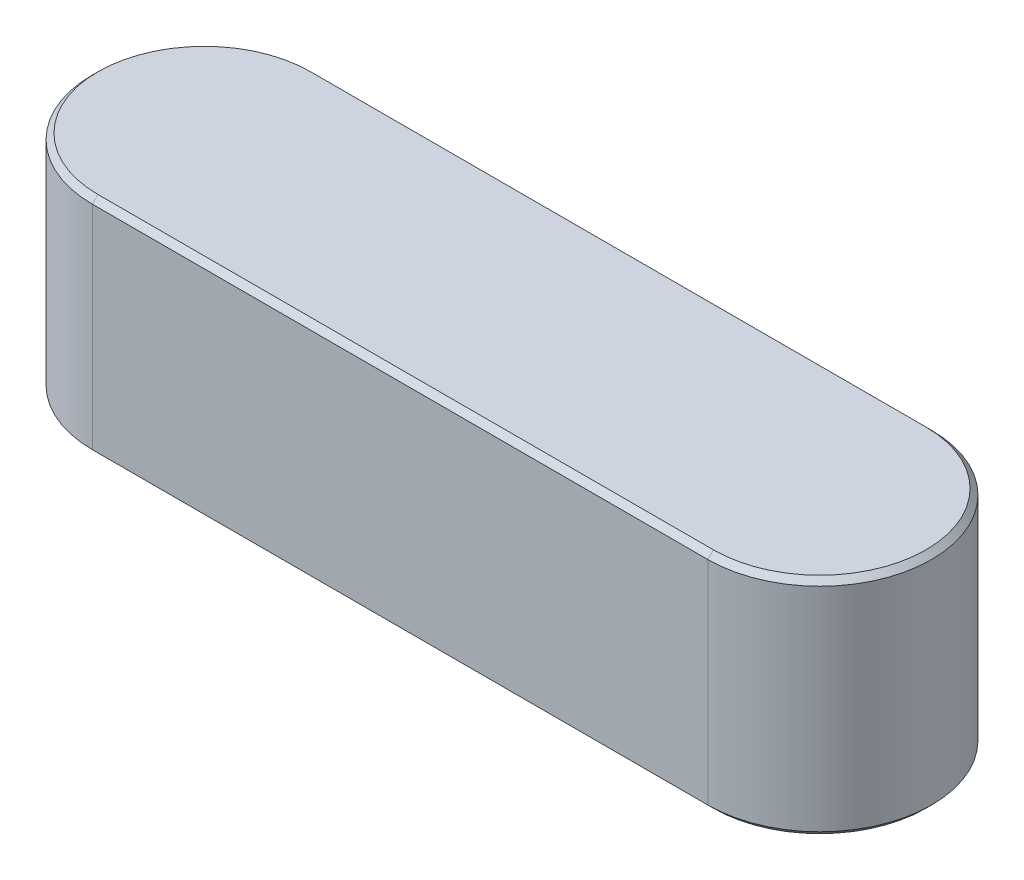
ISO-10303-21;
HEADER;
FILE_DESCRIPTION(('STEP AP214'),'2;1');
FILE_NAME('part.step','',(''),(''),'','','');
FILE_SCHEMA(('AUTOMOTIVE_DESIGN { 1 0 10303 214 1 1 1 1 }'));
ENDSEC;
DATA;
#1=APPLICATION_CONTEXT('core data for automotive mechanical design processes');
#2=APPLICATION_PROTOCOL_DEFINITION('international standard','automotive_design',2000,#1);
#3=PRODUCT_CONTEXT('',#1,'mechanical');
#4=PRODUCT('Part','Part','',(#3));
#5=PRODUCT_RELATED_PRODUCT_CATEGORY('part','',(#4));
#6=PRODUCT_DEFINITION_FORMATION('','',#4);
#7=PRODUCT_DEFINITION_CONTEXT('part definition',#1,'design');
#8=PRODUCT_DEFINITION('design','',#6,#7);
#9=PRODUCT_DEFINITION_SHAPE('','',#8);
#10=(LENGTH_UNIT() NAMED_UNIT(*) SI_UNIT(.MILLI.,.METRE.));
#11=(NAMED_UNIT(*) PLANE_ANGLE_UNIT() SI_UNIT($,.RADIAN.));
#12=(NAMED_UNIT(*) SI_UNIT($,.STERADIAN.) SOLID_ANGLE_UNIT());
#13=UNCERTAINTY_MEASURE_WITH_UNIT(LENGTH_MEASURE(1.E-05),#10,'distance_accuracy_value','');
#14=(GEOMETRIC_REPRESENTATION_CONTEXT(3) GLOBAL_UNCERTAINTY_ASSIGNED_CONTEXT((#13)) GLOBAL_UNIT_ASSIGNED_CONTEXT((#10,
#11,#12)) REPRESENTATION_CONTEXT('',''));
#15=CARTESIAN_POINT('',(0.,0.,0.));
#16=DIRECTION('',(0.,0.,1.));
#17=DIRECTION('',(1.,0.,0.));
#18=AXIS2_PLACEMENT_3D('',#15,#16,#17);
#19=CARTESIAN_POINT('',(-5.5,4.,0.));
#20=DIRECTION('',(0.,-1.,0.));
#21=DIRECTION('',(0.,0.,-1.));
#22=AXIS2_PLACEMENT_3D('',#19,#20,#21);
#23=CYLINDRICAL_SURFACE('',#22,2.);
#24=DIRECTION('',(0.,-1.,0.));
#25=VECTOR('',#24,1.);
#26=CARTESIAN_POINT('',(-5.5,4.,-2.));
#27=LINE('',#26,#25);
#28=CARTESIAN_POINT('',(-5.5,3.9,-2.));
#29=VERTEX_POINT('',#28);
#30=CARTESIAN_POINT('',(-5.5,0.100000000000003,-2.));
#31=VERTEX_POINT('',#30);
#32=EDGE_CURVE('E143',#29,#31,#27,.T.);
#33=ORIENTED_EDGE('',*,*,#32,.T.);
#34=CARTESIAN_POINT('',(-5.5,0.100000000000003,0.));
#35=DIRECTION('',(0.,1.,0.));
#36=DIRECTION('',(0.,0.,1.));
#37=AXIS2_PLACEMENT_3D('',#34,#35,#36);
#38=CIRCLE('',#37,2.);
#39=CARTESIAN_POINT('',(-5.5,0.100000000000003,2.));
#40=VERTEX_POINT('',#39);
#41=EDGE_CURVE('E152',#31,#40,#38,.T.);
#42=ORIENTED_EDGE('',*,*,#41,.T.);
#43=DIRECTION('',(0.,-1.,0.));
#44=VECTOR('',#43,1.);
#45=CARTESIAN_POINT('',(-5.5,4.,2.));
#46=LINE('',#45,#44);
#47=CARTESIAN_POINT('',(-5.5,3.9,2.));
#48=VERTEX_POINT('',#47);
#49=EDGE_CURVE('E121',#48,#40,#46,.T.);
#50=ORIENTED_EDGE('',*,*,#49,.F.);
#51=CARTESIAN_POINT('',(-5.5,3.9,0.));
#52=DIRECTION('',(0.,1.,0.));
#53=DIRECTION('',(0.,0.,1.));
#54=AXIS2_PLACEMENT_3D('',#51,#52,#53);
#55=CIRCLE('',#54,2.);
#56=EDGE_CURVE('E154',#48,#29,#55,.F.);
#57=ORIENTED_EDGE('',*,*,#56,.T.);
#58=EDGE_LOOP('',(#33,#42,#50,#57));
#59=FACE_BOUND('',#58,.T.);
#60=ADVANCED_FACE('F34',(#59),#23,.T.);
#61=CARTESIAN_POINT('',(-5.5,4.,2.));
#62=DIRECTION('',(0.,0.,-1.));
#63=DIRECTION('',(-1.,0.,0.));
#64=AXIS2_PLACEMENT_3D('',#61,#62,#63);
#65=PLANE('',#64);
#66=ORIENTED_EDGE('',*,*,#49,.T.);
#67=DIRECTION('',(1.,0.,0.));
#68=VECTOR('',#67,1.);
#69=CARTESIAN_POINT('',(-5.5,0.100000000000003,2.));
#70=LINE('',#69,#68);
#71=CARTESIAN_POINT('',(5.5,0.100000000000003,2.));
#72=VERTEX_POINT('',#71);
#73=EDGE_CURVE('E120',#40,#72,#70,.T.);
#74=ORIENTED_EDGE('',*,*,#73,.T.);
#75=DIRECTION('',(0.,-1.,0.));
#76=VECTOR('',#75,1.);
#77=CARTESIAN_POINT('',(5.5,4.,2.));
#78=LINE('',#77,#76);
#79=CARTESIAN_POINT('',(5.5,3.9,2.));
#80=VERTEX_POINT('',#79);
#81=EDGE_CURVE('E103',#80,#72,#78,.T.);
#82=ORIENTED_EDGE('',*,*,#81,.F.);
#83=DIRECTION('',(-1.,0.,0.));
#84=VECTOR('',#83,1.);
#85=CARTESIAN_POINT('',(-5.5,3.9,2.));
#86=LINE('',#85,#84);
#87=EDGE_CURVE('E117',#80,#48,#86,.T.);
#88=ORIENTED_EDGE('',*,*,#87,.T.);
#89=EDGE_LOOP('',(#66,#74,#82,#88));
#90=FACE_BOUND('',#89,.T.);
#91=ADVANCED_FACE('F116',(#90),#65,.F.);
#92=CARTESIAN_POINT('',(5.5,4.,0.));
#93=DIRECTION('',(0.,-1.,0.));
#94=DIRECTION('',(0.,0.,-1.));
#95=AXIS2_PLACEMENT_3D('',#92,#93,#94);
#96=CYLINDRICAL_SURFACE('',#95,2.);
#97=ORIENTED_EDGE('',*,*,#81,.T.);
#98=CARTESIAN_POINT('',(5.5,0.100000000000003,0.));
#99=DIRECTION('',(0.,1.,0.));
#100=DIRECTION('',(0.,0.,1.));
#101=AXIS2_PLACEMENT_3D('',#98,#99,#100);
#102=CIRCLE('',#101,2.);
#103=CARTESIAN_POINT('',(5.5,0.100000000000003,-2.));
#104=VERTEX_POINT('',#103);
#105=EDGE_CURVE('E109',#72,#104,#102,.T.);
#106=ORIENTED_EDGE('',*,*,#105,.T.);
#107=DIRECTION('',(0.,-1.,0.));
#108=VECTOR('',#107,1.);
#109=CARTESIAN_POINT('',(5.5,4.,-2.));
#110=LINE('',#109,#108);
#111=CARTESIAN_POINT('',(5.5,3.9,-2.));
#112=VERTEX_POINT('',#111);
#113=EDGE_CURVE('E105',#112,#104,#110,.T.);
#114=ORIENTED_EDGE('',*,*,#113,.F.);
#115=CARTESIAN_POINT('',(5.5,3.9,0.));
#116=DIRECTION('',(0.,1.,0.));
#117=DIRECTION('',(0.,0.,1.));
#118=AXIS2_PLACEMENT_3D('',#115,#116,#117);
#119=CIRCLE('',#118,2.);
#120=EDGE_CURVE('E100',#112,#80,#119,.F.);
#121=ORIENTED_EDGE('',*,*,#120,.T.);
#122=EDGE_LOOP('',(#97,#106,#114,#121));
#123=FACE_BOUND('',#122,.T.);
#124=ADVANCED_FACE('F102',(#123),#96,.T.);
#125=CARTESIAN_POINT('',(-5.5,4.,-2.));
#126=DIRECTION('',(0.,0.,1.));
#127=DIRECTION('',(1.,0.,0.));
#128=AXIS2_PLACEMENT_3D('',#125,#126,#127);
#129=PLANE('',#128);
#130=ORIENTED_EDGE('',*,*,#113,.T.);
#131=DIRECTION('',(-1.,0.,0.));
#132=VECTOR('',#131,1.);
#133=CARTESIAN_POINT('',(-5.5,0.100000000000003,-2.));
#134=LINE('',#133,#132);
#135=EDGE_CURVE('E156',#104,#31,#134,.T.);
#136=ORIENTED_EDGE('',*,*,#135,.T.);
#137=ORIENTED_EDGE('',*,*,#32,.F.);
#138=DIRECTION('',(1.,0.,0.));
#139=VECTOR('',#138,1.);
#140=CARTESIAN_POINT('',(5.5,3.9,-2.));
#141=LINE('',#140,#139);
#142=EDGE_CURVE('E158',#29,#112,#141,.T.);
#143=ORIENTED_EDGE('',*,*,#142,.T.);
#144=EDGE_LOOP('',(#130,#136,#137,#143));
#145=FACE_BOUND('',#144,.T.);
#146=ADVANCED_FACE('F196',(#145),#129,.F.);
#147=CARTESIAN_POINT('',(-5.5,4.,0.));
#148=DIRECTION('',(0.,1.,0.));
#149=DIRECTION('',(0.,0.,1.));
#150=AXIS2_PLACEMENT_3D('',#147,#148,#149);
#151=PLANE('',#150);
#152=CARTESIAN_POINT('',(5.5,4.,0.));
#153=DIRECTION('',(0.,1.,0.));
#154=DIRECTION('',(0.,0.,1.));
#155=AXIS2_PLACEMENT_3D('',#152,#153,#154);
#156=CIRCLE('',#155,1.9);
#157=CARTESIAN_POINT('',(5.5,4.,1.9));
#158=VERTEX_POINT('',#157);
#159=CARTESIAN_POINT('',(5.5,4.,-1.9));
#160=VERTEX_POINT('',#159);
#161=EDGE_CURVE('E43',#158,#160,#156,.T.);
#162=ORIENTED_EDGE('',*,*,#161,.T.);
#163=DIRECTION('',(-1.,0.,0.));
#164=VECTOR('',#163,1.);
#165=CARTESIAN_POINT('',(-5.5,4.,-1.9));
#166=LINE('',#165,#164);
#167=CARTESIAN_POINT('',(-5.5,4.,-1.9));
#168=VERTEX_POINT('',#167);
#169=EDGE_CURVE('E11',#160,#168,#166,.T.);
#170=ORIENTED_EDGE('',*,*,#169,.T.);
#171=CARTESIAN_POINT('',(-5.5,4.,0.));
#172=DIRECTION('',(0.,1.,0.));
#173=DIRECTION('',(0.,0.,1.));
#174=AXIS2_PLACEMENT_3D('',#171,#172,#173);
#175=CIRCLE('',#174,1.9);
#176=CARTESIAN_POINT('',(-5.5,4.,1.9));
#177=VERTEX_POINT('',#176);
#178=EDGE_CURVE('E150',#168,#177,#175,.T.);
#179=ORIENTED_EDGE('',*,*,#178,.T.);
#180=DIRECTION('',(1.,0.,0.));
#181=VECTOR('',#180,1.);
#182=CARTESIAN_POINT('',(5.5,4.,1.9));
#183=LINE('',#182,#181);
#184=EDGE_CURVE('E54',#177,#158,#183,.T.);
#185=ORIENTED_EDGE('',*,*,#184,.T.);
#186=EDGE_LOOP('',(#162,#170,#179,#185));
#187=FACE_BOUND('',#186,.T.);
#188=ADVANCED_FACE('F202',(#187),#151,.T.);
#189=CARTESIAN_POINT('',(-5.5,0.,0.));
#190=DIRECTION('',(0.,1.,0.));
#191=DIRECTION('',(0.,0.,1.));
#192=AXIS2_PLACEMENT_3D('',#189,#190,#191);
#193=PLANE('',#192);
#194=CARTESIAN_POINT('',(5.5,0.,0.));
#195=DIRECTION('',(0.,1.,0.));
#196=DIRECTION('',(0.,0.,1.));
#197=AXIS2_PLACEMENT_3D('',#194,#195,#196);
#198=CIRCLE('',#197,1.9);
#199=CARTESIAN_POINT('',(5.5,0.,-1.9));
#200=VERTEX_POINT('',#199);
#201=CARTESIAN_POINT('',(5.5,0.,1.9));
#202=VERTEX_POINT('',#201);
#203=EDGE_CURVE('E163',#200,#202,#198,.F.);
#204=ORIENTED_EDGE('',*,*,#203,.T.);
#205=DIRECTION('',(-1.,0.,0.));
#206=VECTOR('',#205,1.);
#207=CARTESIAN_POINT('',(-5.5,0.,1.9));
#208=LINE('',#207,#206);
#209=CARTESIAN_POINT('',(-5.5,0.,1.9));
#210=VERTEX_POINT('',#209);
#211=EDGE_CURVE('E110',#202,#210,#208,.T.);
#212=ORIENTED_EDGE('',*,*,#211,.T.);
#213=CARTESIAN_POINT('',(-5.5,0.,0.));
#214=DIRECTION('',(0.,1.,0.));
#215=DIRECTION('',(0.,0.,1.));
#216=AXIS2_PLACEMENT_3D('',#213,#214,#215);
#217=CIRCLE('',#216,1.9);
#218=CARTESIAN_POINT('',(-5.5,0.,-1.9));
#219=VERTEX_POINT('',#218);
#220=EDGE_CURVE('E167',#210,#219,#217,.F.);
#221=ORIENTED_EDGE('',*,*,#220,.T.);
#222=DIRECTION('',(1.,0.,0.));
#223=VECTOR('',#222,1.);
#224=CARTESIAN_POINT('',(-5.5,0.,-1.9));
#225=LINE('',#224,#223);
#226=EDGE_CURVE('E165',#219,#200,#225,.T.);
#227=ORIENTED_EDGE('',*,*,#226,.T.);
#228=EDGE_LOOP('',(#204,#212,#221,#227));
#229=FACE_BOUND('',#228,.T.);
#230=ADVANCED_FACE('F204',(#229),#193,.F.);
#231=CARTESIAN_POINT('',(-5.5,0.100000000000003,-2.));
#232=DIRECTION('',(0.,0.707106781186541,0.707106781186554));
#233=DIRECTION('',(-1.,0.,0.));
#234=AXIS2_PLACEMENT_3D('',#231,#232,#233);
#235=PLANE('',#234);
#236=DIRECTION('',(0.,0.707106781186554,-0.707106781186541));
#237=VECTOR('',#236,1.);
#238=CARTESIAN_POINT('',(5.5,0.,-1.9));
#239=LINE('',#238,#237);
#240=EDGE_CURVE('E144',#200,#104,#239,.T.);
#241=ORIENTED_EDGE('',*,*,#240,.F.);
#242=ORIENTED_EDGE('',*,*,#226,.F.);
#243=DIRECTION('',(0.,-0.707106781186554,0.707106781186541));
#244=VECTOR('',#243,1.);
#245=CARTESIAN_POINT('',(-5.5,0.100000000000003,-2.));
#246=LINE('',#245,#244);
#247=EDGE_CURVE('E140',#31,#219,#246,.T.);
#248=ORIENTED_EDGE('',*,*,#247,.F.);
#249=ORIENTED_EDGE('',*,*,#135,.F.);
#250=EDGE_LOOP('',(#241,#242,#248,#249));
#251=FACE_BOUND('',#250,.T.);
#252=ADVANCED_FACE('F183',(#251),#235,.F.);
#253=CARTESIAN_POINT('',(-5.5,0.100000000000003,0.));
#254=DIRECTION('',(0.,1.,0.));
#255=DIRECTION('',(0.,0.,1.));
#256=AXIS2_PLACEMENT_3D('',#253,#254,#255);
#257=CONICAL_SURFACE('',#256,2.,0.78539816339744);
#258=ORIENTED_EDGE('',*,*,#247,.T.);
#259=ORIENTED_EDGE('',*,*,#220,.F.);
#260=DIRECTION('',(0.,-0.707106781186554,-0.707106781186541));
#261=VECTOR('',#260,1.);
#262=CARTESIAN_POINT('',(-5.5,0.100000000000003,2.));
#263=LINE('',#262,#261);
#264=EDGE_CURVE('E131',#40,#210,#263,.T.);
#265=ORIENTED_EDGE('',*,*,#264,.F.);
#266=ORIENTED_EDGE('',*,*,#41,.F.);
#267=EDGE_LOOP('',(#258,#259,#265,#266));
#268=FACE_BOUND('',#267,.T.);
#269=ADVANCED_FACE('F187',(#268),#257,.T.);
#270=CARTESIAN_POINT('',(5.5,0.100000000000003,0.));
#271=DIRECTION('',(0.,1.,0.));
#272=DIRECTION('',(0.,0.,1.));
#273=AXIS2_PLACEMENT_3D('',#270,#271,#272);
#274=CONICAL_SURFACE('',#273,2.,0.78539816339744);
#275=ORIENTED_EDGE('',*,*,#240,.T.);
#276=ORIENTED_EDGE('',*,*,#105,.F.);
#277=DIRECTION('',(0.,0.707106781186554,0.707106781186541));
#278=VECTOR('',#277,1.);
#279=CARTESIAN_POINT('',(5.5,0.,1.9));
#280=LINE('',#279,#278);
#281=EDGE_CURVE('E130',#202,#72,#280,.T.);
#282=ORIENTED_EDGE('',*,*,#281,.F.);
#283=ORIENTED_EDGE('',*,*,#203,.F.);
#284=EDGE_LOOP('',(#275,#276,#282,#283));
#285=FACE_BOUND('',#284,.T.);
#286=ADVANCED_FACE('F195',(#285),#274,.T.);
#287=CARTESIAN_POINT('',(-5.5,0.100000000000003,2.));
#288=DIRECTION('',(0.,0.707106781186541,-0.707106781186554));
#289=DIRECTION('',(1.,0.,0.));
#290=AXIS2_PLACEMENT_3D('',#287,#288,#289);
#291=PLANE('',#290);
#292=ORIENTED_EDGE('',*,*,#264,.T.);
#293=ORIENTED_EDGE('',*,*,#211,.F.);
#294=ORIENTED_EDGE('',*,*,#281,.T.);
#295=ORIENTED_EDGE('',*,*,#73,.F.);
#296=EDGE_LOOP('',(#292,#293,#294,#295));
#297=FACE_BOUND('',#296,.T.);
#298=ADVANCED_FACE('F190',(#297),#291,.F.);
#299=CARTESIAN_POINT('',(-5.5,4.,1.9));
#300=DIRECTION('',(0.,0.707106781186554,0.707106781186541));
#301=DIRECTION('',(-1.,0.,0.));
#302=AXIS2_PLACEMENT_3D('',#299,#300,#301);
#303=PLANE('',#302);
#304=DIRECTION('',(0.,0.707106781186541,-0.707106781186554));
#305=VECTOR('',#304,1.);
#306=CARTESIAN_POINT('',(-5.5,3.9,2.));
#307=LINE('',#306,#305);
#308=EDGE_CURVE('E126',#48,#177,#307,.T.);
#309=ORIENTED_EDGE('',*,*,#308,.F.);
#310=ORIENTED_EDGE('',*,*,#87,.F.);
#311=DIRECTION('',(0.,-0.707106781186541,0.707106781186554));
#312=VECTOR('',#311,1.);
#313=CARTESIAN_POINT('',(5.5,4.,1.9));
#314=LINE('',#313,#312);
#315=EDGE_CURVE('E38',#158,#80,#314,.T.);
#316=ORIENTED_EDGE('',*,*,#315,.F.);
#317=ORIENTED_EDGE('',*,*,#184,.F.);
#318=EDGE_LOOP('',(#309,#310,#316,#317));
#319=FACE_BOUND('',#318,.T.);
#320=ADVANCED_FACE('F36',(#319),#303,.T.);
#321=CARTESIAN_POINT('',(5.5,4.,0.));
#322=DIRECTION('',(0.,-1.,0.));
#323=DIRECTION('',(0.,0.,-1.));
#324=AXIS2_PLACEMENT_3D('',#321,#322,#323);
#325=CONICAL_SURFACE('',#324,1.9,0.785398163397457);
#326=ORIENTED_EDGE('',*,*,#315,.T.);
#327=ORIENTED_EDGE('',*,*,#120,.F.);
#328=DIRECTION('',(0.,-0.707106781186541,-0.707106781186554));
#329=VECTOR('',#328,1.);
#330=CARTESIAN_POINT('',(5.5,4.,-1.9));
#331=LINE('',#330,#329);
#332=EDGE_CURVE('E133',#160,#112,#331,.T.);
#333=ORIENTED_EDGE('',*,*,#332,.F.);
#334=ORIENTED_EDGE('',*,*,#161,.F.);
#335=EDGE_LOOP('',(#326,#327,#333,#334));
#336=FACE_BOUND('',#335,.T.);
#337=ADVANCED_FACE('F129',(#336),#325,.T.);
#338=CARTESIAN_POINT('',(-5.5,4.,0.));
#339=DIRECTION('',(0.,-1.,0.));
#340=DIRECTION('',(0.,0.,-1.));
#341=AXIS2_PLACEMENT_3D('',#338,#339,#340);
#342=CONICAL_SURFACE('',#341,1.9,0.785398163397457);
#343=ORIENTED_EDGE('',*,*,#308,.T.);
#344=ORIENTED_EDGE('',*,*,#178,.F.);
#345=DIRECTION('',(0.,0.707106781186541,0.707106781186554));
#346=VECTOR('',#345,1.);
#347=CARTESIAN_POINT('',(-5.5,3.9,-2.));
#348=LINE('',#347,#346);
#349=EDGE_CURVE('E136',#29,#168,#348,.T.);
#350=ORIENTED_EDGE('',*,*,#349,.F.);
#351=ORIENTED_EDGE('',*,*,#56,.F.);
#352=EDGE_LOOP('',(#343,#344,#350,#351));
#353=FACE_BOUND('',#352,.T.);
#354=ADVANCED_FACE('F201',(#353),#342,.T.);
#355=CARTESIAN_POINT('',(-5.5,4.,-1.9));
#356=DIRECTION('',(0.,0.707106781186554,-0.707106781186541));
#357=DIRECTION('',(1.,0.,0.));
#358=AXIS2_PLACEMENT_3D('',#355,#356,#357);
#359=PLANE('',#358);
#360=ORIENTED_EDGE('',*,*,#332,.T.);
#361=ORIENTED_EDGE('',*,*,#142,.F.);
#362=ORIENTED_EDGE('',*,*,#349,.T.);
#363=ORIENTED_EDGE('',*,*,#169,.F.);
#364=EDGE_LOOP('',(#360,#361,#362,#363));
#365=FACE_BOUND('',#364,.T.);
#366=ADVANCED_FACE('F199',(#365),#359,.T.);
#367=CLOSED_SHELL('',(#60,#91,#124,#146,#188,#230,#252,#269,#286,#298,#320,#337,#354,#366));
#368=MANIFOLD_SOLID_BREP('B2',#367);
#369=ADVANCED_BREP_SHAPE_REPRESENTATION('',(#18,#368),#14);
#370=SHAPE_DEFINITION_REPRESENTATION(#9,#369);
ENDSEC;
END-ISO-10303-21;
